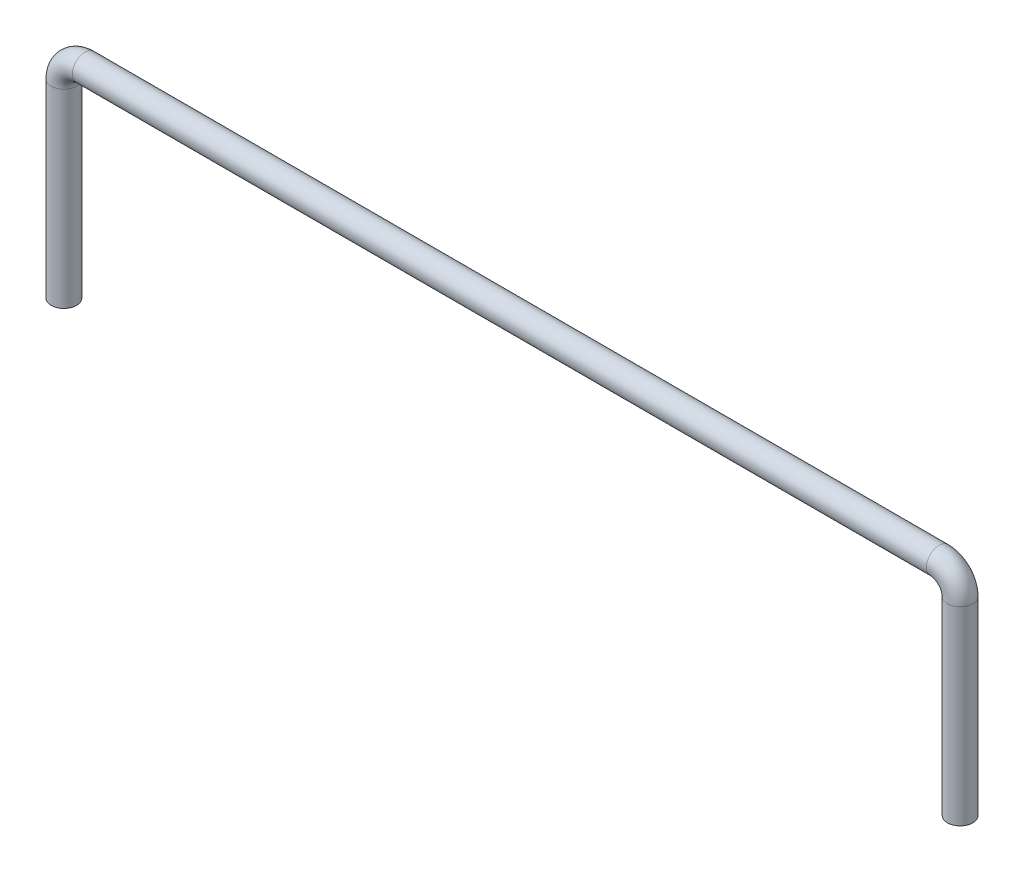
ISO-10303-21;
HEADER;
FILE_DESCRIPTION(('STEP AP214'),'2;1');
FILE_NAME('part.step','',(''),(''),'','','');
FILE_SCHEMA(('AUTOMOTIVE_DESIGN { 1 0 10303 214 1 1 1 1 }'));
ENDSEC;
DATA;
#1=APPLICATION_CONTEXT('core data for automotive mechanical design processes');
#2=APPLICATION_PROTOCOL_DEFINITION('international standard','automotive_design',2000,#1);
#3=PRODUCT_CONTEXT('',#1,'mechanical');
#4=PRODUCT('Part','Part','',(#3));
#5=PRODUCT_RELATED_PRODUCT_CATEGORY('part','',(#4));
#6=PRODUCT_DEFINITION_FORMATION('','',#4);
#7=PRODUCT_DEFINITION_CONTEXT('part definition',#1,'design');
#8=PRODUCT_DEFINITION('design','',#6,#7);
#9=PRODUCT_DEFINITION_SHAPE('','',#8);
#10=(LENGTH_UNIT() NAMED_UNIT(*) SI_UNIT(.MILLI.,.METRE.));
#11=(NAMED_UNIT(*) PLANE_ANGLE_UNIT() SI_UNIT($,.RADIAN.));
#12=(NAMED_UNIT(*) SI_UNIT($,.STERADIAN.) SOLID_ANGLE_UNIT());
#13=UNCERTAINTY_MEASURE_WITH_UNIT(LENGTH_MEASURE(1.E-05),#10,'distance_accuracy_value','');
#14=(GEOMETRIC_REPRESENTATION_CONTEXT(3) GLOBAL_UNCERTAINTY_ASSIGNED_CONTEXT((#13)) GLOBAL_UNIT_ASSIGNED_CONTEXT((#10,
#11,#12)) REPRESENTATION_CONTEXT('',''));
#15=CARTESIAN_POINT('',(0.,0.,0.));
#16=DIRECTION('',(0.,0.,1.));
#17=DIRECTION('',(1.,0.,0.));
#18=AXIS2_PLACEMENT_3D('',#15,#16,#17);
#19=CARTESIAN_POINT('',(0.,0.,0.));
#20=DIRECTION('',(0.,-1.,0.));
#21=DIRECTION('',(0.,0.,1.));
#22=AXIS2_PLACEMENT_3D('',#19,#20,#21);
#23=PLANE('',#22);
#24=CARTESIAN_POINT('',(0.,0.,0.));
#25=DIRECTION('',(0.,-1.,0.));
#26=DIRECTION('',(0.,0.,1.));
#27=AXIS2_PLACEMENT_3D('',#24,#25,#26);
#28=CIRCLE('',#27,0.600000000000003);
#29=CARTESIAN_POINT('',(0.,0.,0.600000000000003));
#30=VERTEX_POINT('',#29);
#31=EDGE_CURVE('E71',#30,#30,#28,.T.);
#32=ORIENTED_EDGE('',*,*,#31,.T.);
#33=EDGE_LOOP('',(#32));
#34=FACE_BOUND('',#33,.T.);
#35=ADVANCED_FACE('F49',(#34),#23,.T.);
#36=CARTESIAN_POINT('',(42.5,0.,0.));
#37=DIRECTION('',(0.,1.,0.));
#38=DIRECTION('',(0.,0.,1.));
#39=AXIS2_PLACEMENT_3D('',#36,#37,#38);
#40=PLANE('',#39);
#41=CARTESIAN_POINT('',(42.5,0.,0.));
#42=DIRECTION('',(0.,1.,0.));
#43=DIRECTION('',(0.,0.,1.));
#44=AXIS2_PLACEMENT_3D('',#41,#42,#43);
#45=CIRCLE('',#44,0.600000000000003);
#46=CARTESIAN_POINT('',(42.5,0.,0.600000000000003));
#47=VERTEX_POINT('',#46);
#48=EDGE_CURVE('E11',#47,#47,#45,.T.);
#49=ORIENTED_EDGE('',*,*,#48,.F.);
#50=EDGE_LOOP('',(#49));
#51=FACE_BOUND('',#50,.T.);
#52=ADVANCED_FACE('F79',(#51),#40,.F.);
#53=CARTESIAN_POINT('',(0.,0.,0.));
#54=DIRECTION('',(0.,1.,0.));
#55=DIRECTION('',(0.,0.,1.));
#56=AXIS2_PLACEMENT_3D('',#53,#54,#55);
#57=CYLINDRICAL_SURFACE('',#56,0.600000000000003);
#58=CARTESIAN_POINT('',(0.,9.,0.));
#59=DIRECTION('',(0.,-1.,0.));
#60=DIRECTION('',(0.,0.,1.));
#61=AXIS2_PLACEMENT_3D('',#58,#59,#60);
#62=CIRCLE('',#61,0.600000000000003);
#63=CARTESIAN_POINT('',(-0.600000000000003,9.,0.));
#64=VERTEX_POINT('',#63);
#65=EDGE_CURVE('E68',#64,#64,#62,.T.);
#66=ORIENTED_EDGE('',*,*,#65,.T.);
#67=EDGE_LOOP('',(#66));
#68=FACE_BOUND('',#67,.T.);
#69=ORIENTED_EDGE('',*,*,#31,.F.);
#70=EDGE_LOOP('',(#69));
#71=FACE_BOUND('',#70,.T.);
#72=ADVANCED_FACE('F76',(#68,#71),#57,.T.);
#73=CARTESIAN_POINT('',(1.,9.,0.));
#74=DIRECTION('',(0.,0.,-1.));
#75=DIRECTION('',(-1.,0.,0.));
#76=AXIS2_PLACEMENT_3D('',#73,#74,#75);
#77=TOROIDAL_SURFACE('',#76,1.,0.600000000000003);
#78=CARTESIAN_POINT('',(1.,10.,0.));
#79=DIRECTION('',(-1.,0.,0.));
#80=DIRECTION('',(0.,0.,1.));
#81=AXIS2_PLACEMENT_3D('',#78,#79,#80);
#82=CIRCLE('',#81,0.600000000000003);
#83=CARTESIAN_POINT('',(1.,10.6,0.));
#84=VERTEX_POINT('',#83);
#85=EDGE_CURVE('E63',#84,#84,#82,.T.);
#86=CARTESIAN_POINT('',(1.,9.,0.));
#87=DIRECTION('',(0.,0.,-1.));
#88=DIRECTION('',(-1.,0.,0.));
#89=AXIS2_PLACEMENT_3D('',#86,#87,#88);
#90=CIRCLE('',#89,1.6);
#91=EDGE_CURVE('',#64,#84,#90,.T.);
#92=ORIENTED_EDGE('',*,*,#65,.F.);
#93=ORIENTED_EDGE('',*,*,#85,.T.);
#94=ORIENTED_EDGE('',*,*,#91,.T.);
#95=ORIENTED_EDGE('',*,*,#91,.F.);
#96=EDGE_LOOP('',(#92,#94,#93,#95));
#97=FACE_BOUND('',#96,.T.);
#98=ADVANCED_FACE('F78',(#97),#77,.T.);
#99=CARTESIAN_POINT('',(1.,10.,0.));
#100=DIRECTION('',(1.,0.,0.));
#101=DIRECTION('',(0.,1.,0.));
#102=AXIS2_PLACEMENT_3D('',#99,#100,#101);
#103=CYLINDRICAL_SURFACE('',#102,0.600000000000003);
#104=CARTESIAN_POINT('',(41.5,10.,0.));
#105=DIRECTION('',(-1.,0.,0.));
#106=DIRECTION('',(0.,0.,1.));
#107=AXIS2_PLACEMENT_3D('',#104,#105,#106);
#108=CIRCLE('',#107,0.600000000000003);
#109=CARTESIAN_POINT('',(41.5,10.6,0.));
#110=VERTEX_POINT('',#109);
#111=EDGE_CURVE('E59',#110,#110,#108,.T.);
#112=ORIENTED_EDGE('',*,*,#111,.T.);
#113=EDGE_LOOP('',(#112));
#114=FACE_BOUND('',#113,.T.);
#115=ORIENTED_EDGE('',*,*,#85,.F.);
#116=EDGE_LOOP('',(#115));
#117=FACE_BOUND('',#116,.T.);
#118=ADVANCED_FACE('F86',(#114,#117),#103,.T.);
#119=CARTESIAN_POINT('',(41.5,9.,0.));
#120=DIRECTION('',(0.,0.,-1.));
#121=DIRECTION('',(-1.,0.,0.));
#122=AXIS2_PLACEMENT_3D('',#119,#120,#121);
#123=TOROIDAL_SURFACE('',#122,1.,0.600000000000003);
#124=CARTESIAN_POINT('',(42.5,9.,0.));
#125=DIRECTION('',(0.,1.,0.));
#126=DIRECTION('',(0.,0.,1.));
#127=AXIS2_PLACEMENT_3D('',#124,#125,#126);
#128=CIRCLE('',#127,0.600000000000003);
#129=CARTESIAN_POINT('',(43.1,9.,0.));
#130=VERTEX_POINT('',#129);
#131=EDGE_CURVE('E55',#130,#130,#128,.T.);
#132=CARTESIAN_POINT('',(41.5,9.,0.));
#133=DIRECTION('',(0.,0.,-1.));
#134=DIRECTION('',(-1.,0.,0.));
#135=AXIS2_PLACEMENT_3D('',#132,#133,#134);
#136=CIRCLE('',#135,1.6);
#137=EDGE_CURVE('',#110,#130,#136,.T.);
#138=ORIENTED_EDGE('',*,*,#111,.F.);
#139=ORIENTED_EDGE('',*,*,#131,.T.);
#140=ORIENTED_EDGE('',*,*,#137,.T.);
#141=ORIENTED_EDGE('',*,*,#137,.F.);
#142=EDGE_LOOP('',(#138,#140,#139,#141));
#143=FACE_BOUND('',#142,.T.);
#144=ADVANCED_FACE('F92',(#143),#123,.T.);
#145=CARTESIAN_POINT('',(42.5,9.,0.));
#146=DIRECTION('',(0.,-1.,0.));
#147=DIRECTION('',(0.,0.,-1.));
#148=AXIS2_PLACEMENT_3D('',#145,#146,#147);
#149=CYLINDRICAL_SURFACE('',#148,0.600000000000003);
#150=ORIENTED_EDGE('',*,*,#48,.T.);
#151=EDGE_LOOP('',(#150));
#152=FACE_BOUND('',#151,.T.);
#153=ORIENTED_EDGE('',*,*,#131,.F.);
#154=EDGE_LOOP('',(#153));
#155=FACE_BOUND('',#154,.T.);
#156=ADVANCED_FACE('F90',(#152,#155),#149,.T.);
#157=CLOSED_SHELL('',(#35,#52,#72,#98,#118,#144,#156));
#158=MANIFOLD_SOLID_BREP('B2',#157);
#159=ADVANCED_BREP_SHAPE_REPRESENTATION('',(#18,#158),#14);
#160=SHAPE_DEFINITION_REPRESENTATION(#9,#159);
ENDSEC;
END-ISO-10303-21;
